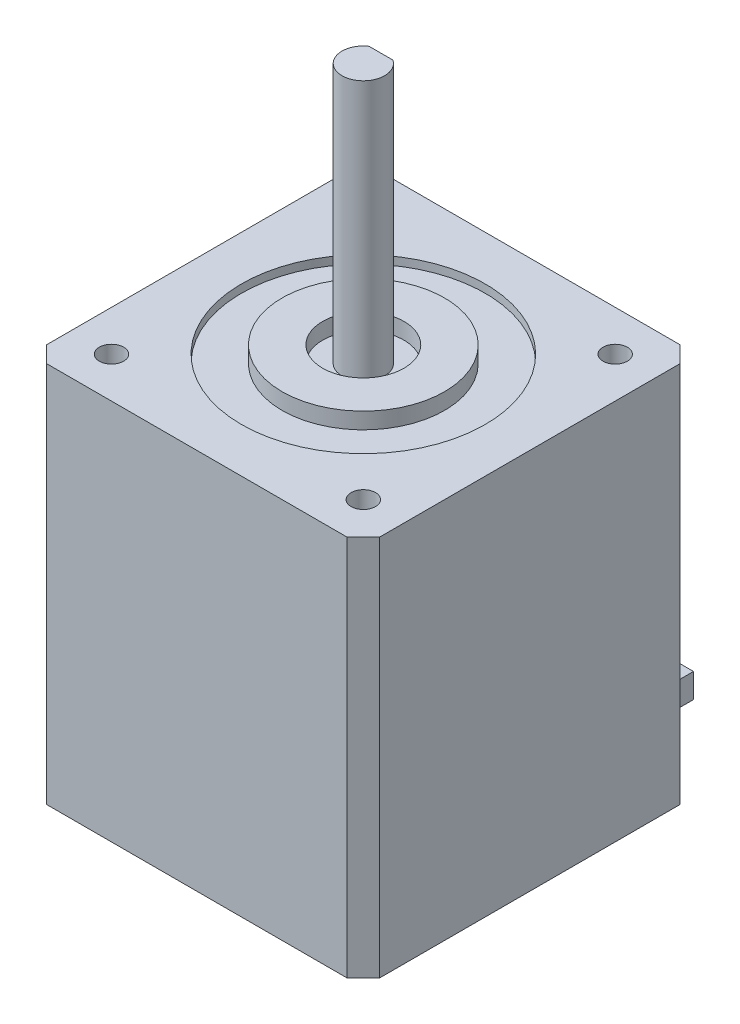
ISO-10303-21;
HEADER;
FILE_DESCRIPTION(('STEP AP214'),'2;1');
FILE_NAME('part.step','',(''),(''),'','','');
FILE_SCHEMA(('AUTOMOTIVE_DESIGN { 1 0 10303 214 1 1 1 1 }'));
ENDSEC;
DATA;
#1=APPLICATION_CONTEXT('core data for automotive mechanical design processes');
#2=APPLICATION_PROTOCOL_DEFINITION('international standard','automotive_design',2000,#1);
#3=PRODUCT_CONTEXT('',#1,'mechanical');
#4=PRODUCT('Part','Part','',(#3));
#5=PRODUCT_RELATED_PRODUCT_CATEGORY('part','',(#4));
#6=PRODUCT_DEFINITION_FORMATION('','',#4);
#7=PRODUCT_DEFINITION_CONTEXT('part definition',#1,'design');
#8=PRODUCT_DEFINITION('design','',#6,#7);
#9=PRODUCT_DEFINITION_SHAPE('','',#8);
#10=(LENGTH_UNIT() NAMED_UNIT(*) SI_UNIT(.MILLI.,.METRE.));
#11=(NAMED_UNIT(*) PLANE_ANGLE_UNIT() SI_UNIT($,.RADIAN.));
#12=(NAMED_UNIT(*) SI_UNIT($,.STERADIAN.) SOLID_ANGLE_UNIT());
#13=UNCERTAINTY_MEASURE_WITH_UNIT(LENGTH_MEASURE(1.E-05),#10,'distance_accuracy_value','');
#14=(GEOMETRIC_REPRESENTATION_CONTEXT(3) GLOBAL_UNCERTAINTY_ASSIGNED_CONTEXT((#13)) GLOBAL_UNIT_ASSIGNED_CONTEXT((#10,
#11,#12)) REPRESENTATION_CONTEXT('',''));
#15=CARTESIAN_POINT('',(0.,0.,0.));
#16=DIRECTION('',(0.,0.,1.));
#17=DIRECTION('',(1.,0.,0.));
#18=AXIS2_PLACEMENT_3D('',#15,#16,#17);
#19=CARTESIAN_POINT('',(-18.5,47.,-20.5));
#20=DIRECTION('',(0.,0.,1.));
#21=DIRECTION('',(1.,0.,0.));
#22=AXIS2_PLACEMENT_3D('',#19,#20,#21);
#23=PLANE('',#22);
#24=DIRECTION('',(0.,-1.,0.));
#25=VECTOR('',#24,1.);
#26=CARTESIAN_POINT('',(10.1415461571168,0.,-20.5));
#27=LINE('',#26,#25);
#28=CARTESIAN_POINT('',(10.1415461571168,3.,-20.5));
#29=VERTEX_POINT('',#28);
#30=CARTESIAN_POINT('',(10.1415461571168,0.,-20.5));
#31=VERTEX_POINT('',#30);
#32=EDGE_CURVE('E57',#29,#31,#27,.T.);
#33=ORIENTED_EDGE('',*,*,#32,.F.);
#34=DIRECTION('',(1.,0.,0.));
#35=VECTOR('',#34,1.);
#36=CARTESIAN_POINT('',(10.1415461571168,3.,-20.5));
#37=LINE('',#36,#35);
#38=CARTESIAN_POINT('',(-9.85845384288318,3.,-20.5));
#39=VERTEX_POINT('',#38);
#40=EDGE_CURVE('E174',#39,#29,#37,.T.);
#41=ORIENTED_EDGE('',*,*,#40,.F.);
#42=DIRECTION('',(0.,1.,0.));
#43=VECTOR('',#42,1.);
#44=CARTESIAN_POINT('',(-9.85845384288318,0.,-20.5));
#45=LINE('',#44,#43);
#46=CARTESIAN_POINT('',(-9.85845384288318,0.,-20.5));
#47=VERTEX_POINT('',#46);
#48=EDGE_CURVE('E63',#47,#39,#45,.T.);
#49=ORIENTED_EDGE('',*,*,#48,.F.);
#50=DIRECTION('',(-1.,0.,0.));
#51=VECTOR('',#50,1.);
#52=CARTESIAN_POINT('',(-18.5,0.,-20.5));
#53=LINE('',#52,#51);
#54=CARTESIAN_POINT('',(-18.5,0.,-20.5));
#55=VERTEX_POINT('',#54);
#56=EDGE_CURVE('E234',#47,#55,#53,.T.);
#57=ORIENTED_EDGE('',*,*,#56,.T.);
#58=DIRECTION('',(0.,-1.,0.));
#59=VECTOR('',#58,1.);
#60=CARTESIAN_POINT('',(-18.5,47.,-20.5));
#61=LINE('',#60,#59);
#62=CARTESIAN_POINT('',(-18.5,47.,-20.5));
#63=VERTEX_POINT('',#62);
#64=EDGE_CURVE('E50',#63,#55,#61,.T.);
#65=ORIENTED_EDGE('',*,*,#64,.F.);
#66=DIRECTION('',(-1.,0.,0.));
#67=VECTOR('',#66,1.);
#68=CARTESIAN_POINT('',(-18.5,47.,-20.5));
#69=LINE('',#68,#67);
#70=CARTESIAN_POINT('',(18.5,47.,-20.5));
#71=VERTEX_POINT('',#70);
#72=EDGE_CURVE('E237',#71,#63,#69,.T.);
#73=ORIENTED_EDGE('',*,*,#72,.F.);
#74=DIRECTION('',(0.,-1.,0.));
#75=VECTOR('',#74,1.);
#76=CARTESIAN_POINT('',(18.5,47.,-20.5));
#77=LINE('',#76,#75);
#78=CARTESIAN_POINT('',(18.5,0.,-20.5));
#79=VERTEX_POINT('',#78);
#80=EDGE_CURVE('E255',#71,#79,#77,.T.);
#81=ORIENTED_EDGE('',*,*,#80,.T.);
#82=EDGE_CURVE('E256',#79,#31,#53,.T.);
#83=ORIENTED_EDGE('',*,*,#82,.T.);
#84=EDGE_LOOP('',(#33,#41,#49,#57,#65,#73,#81,#83));
#85=FACE_BOUND('',#84,.T.);
#86=ADVANCED_FACE('F43',(#85),#23,.F.);
#87=CARTESIAN_POINT('',(0.,46.,0.));
#88=DIRECTION('',(0.,1.,0.));
#89=DIRECTION('',(0.,0.,1.));
#90=AXIS2_PLACEMENT_3D('',#87,#88,#89);
#91=PLANE('',#90);
#92=CARTESIAN_POINT('',(0.,46.,0.));
#93=DIRECTION('',(0.,1.,0.));
#94=DIRECTION('',(0.,0.,1.));
#95=AXIS2_PLACEMENT_3D('',#92,#93,#94);
#96=CIRCLE('',#95,5.);
#97=CARTESIAN_POINT('',(0.,46.,5.));
#98=VERTEX_POINT('',#97);
#99=EDGE_CURVE('E11',#98,#98,#96,.F.);
#100=ORIENTED_EDGE('',*,*,#99,.F.);
#101=EDGE_LOOP('',(#100));
#102=FACE_BOUND('',#101,.T.);
#103=DIRECTION('',(-1.,0.,0.));
#104=VECTOR('',#103,1.);
#105=CARTESIAN_POINT('',(-1.47098416147173,46.,-2.17535911633604));
#106=LINE('',#105,#104);
#107=CARTESIAN_POINT('',(1.47098416147173,46.,-2.17535911633604));
#108=VERTEX_POINT('',#107);
#109=CARTESIAN_POINT('',(-1.47098416147173,46.,-2.17535911633604));
#110=VERTEX_POINT('',#109);
#111=EDGE_CURVE('E211',#108,#110,#106,.T.);
#112=ORIENTED_EDGE('',*,*,#111,.F.);
#113=CARTESIAN_POINT('',(0.,46.,0.));
#114=DIRECTION('',(0.,1.,0.));
#115=DIRECTION('',(0.,0.,1.));
#116=AXIS2_PLACEMENT_3D('',#113,#114,#115);
#117=CIRCLE('',#116,2.62602012336673);
#118=EDGE_CURVE('E206',#110,#108,#117,.T.);
#119=ORIENTED_EDGE('',*,*,#118,.F.);
#120=EDGE_LOOP('',(#112,#119));
#121=FACE_BOUND('',#120,.T.);
#122=ADVANCED_FACE('F338',(#102,#121),#91,.T.);
#123=CARTESIAN_POINT('',(0.,46.,0.));
#124=DIRECTION('',(0.,1.,0.));
#125=DIRECTION('',(0.,0.,1.));
#126=AXIS2_PLACEMENT_3D('',#123,#124,#125);
#127=CIRCLE('',#126,15.);
#128=CARTESIAN_POINT('',(0.,46.,15.));
#129=VERTEX_POINT('',#128);
#130=EDGE_CURVE('E231',#129,#129,#127,.T.);
#131=ORIENTED_EDGE('',*,*,#130,.T.);
#132=EDGE_LOOP('',(#131));
#133=FACE_BOUND('',#132,.T.);
#134=CARTESIAN_POINT('',(0.,46.,0.));
#135=DIRECTION('',(0.,1.,0.));
#136=DIRECTION('',(0.,0.,1.));
#137=AXIS2_PLACEMENT_3D('',#134,#135,#136);
#138=CIRCLE('',#137,10.);
#139=CARTESIAN_POINT('',(0.,46.,10.));
#140=VERTEX_POINT('',#139);
#141=EDGE_CURVE('E224',#140,#140,#138,.T.);
#142=ORIENTED_EDGE('',*,*,#141,.F.);
#143=EDGE_LOOP('',(#142));
#144=FACE_BOUND('',#143,.T.);
#145=ADVANCED_FACE('F343',(#133,#144),#91,.T.);
#146=CARTESIAN_POINT('',(-20.5,47.,-18.5));
#147=DIRECTION('',(0.707106781186547,0.,0.707106781186548));
#148=DIRECTION('',(0.707106781186548,0.,-0.707106781186547));
#149=AXIS2_PLACEMENT_3D('',#146,#147,#148);
#150=PLANE('',#149);
#151=DIRECTION('',(-0.707106781186548,0.,0.707106781186547));
#152=VECTOR('',#151,1.);
#153=CARTESIAN_POINT('',(-20.5,0.,-18.5));
#154=LINE('',#153,#152);
#155=CARTESIAN_POINT('',(-20.5,0.,-18.5));
#156=VERTEX_POINT('',#155);
#157=EDGE_CURVE('E258',#55,#156,#154,.T.);
#158=ORIENTED_EDGE('',*,*,#157,.T.);
#159=DIRECTION('',(0.,-1.,0.));
#160=VECTOR('',#159,1.);
#161=CARTESIAN_POINT('',(-20.5,47.,-18.5));
#162=LINE('',#161,#160);
#163=CARTESIAN_POINT('',(-20.5,47.,-18.5));
#164=VERTEX_POINT('',#163);
#165=EDGE_CURVE('E288',#164,#156,#162,.T.);
#166=ORIENTED_EDGE('',*,*,#165,.F.);
#167=DIRECTION('',(-0.707106781186548,0.,0.707106781186547));
#168=VECTOR('',#167,1.);
#169=CARTESIAN_POINT('',(-20.5,47.,-18.5));
#170=LINE('',#169,#168);
#171=EDGE_CURVE('E240',#63,#164,#170,.T.);
#172=ORIENTED_EDGE('',*,*,#171,.F.);
#173=ORIENTED_EDGE('',*,*,#64,.T.);
#174=EDGE_LOOP('',(#158,#166,#172,#173));
#175=FACE_BOUND('',#174,.T.);
#176=ADVANCED_FACE('F293',(#175),#150,.F.);
#177=CARTESIAN_POINT('',(-20.5,47.,18.5));
#178=DIRECTION('',(1.,0.,0.));
#179=DIRECTION('',(0.,0.,-1.));
#180=AXIS2_PLACEMENT_3D('',#177,#178,#179);
#181=PLANE('',#180);
#182=DIRECTION('',(0.,0.,1.));
#183=VECTOR('',#182,1.);
#184=CARTESIAN_POINT('',(-20.5,0.,18.5));
#185=LINE('',#184,#183);
#186=CARTESIAN_POINT('',(-20.5,0.,18.5));
#187=VERTEX_POINT('',#186);
#188=EDGE_CURVE('E260',#156,#187,#185,.T.);
#189=ORIENTED_EDGE('',*,*,#188,.T.);
#190=DIRECTION('',(0.,-1.,0.));
#191=VECTOR('',#190,1.);
#192=CARTESIAN_POINT('',(-20.5,47.,18.5));
#193=LINE('',#192,#191);
#194=CARTESIAN_POINT('',(-20.5,47.,18.5));
#195=VERTEX_POINT('',#194);
#196=EDGE_CURVE('E285',#195,#187,#193,.T.);
#197=ORIENTED_EDGE('',*,*,#196,.F.);
#198=DIRECTION('',(0.,0.,1.));
#199=VECTOR('',#198,1.);
#200=CARTESIAN_POINT('',(-20.5,47.,18.5));
#201=LINE('',#200,#199);
#202=EDGE_CURVE('E243',#164,#195,#201,.T.);
#203=ORIENTED_EDGE('',*,*,#202,.F.);
#204=ORIENTED_EDGE('',*,*,#165,.T.);
#205=EDGE_LOOP('',(#189,#197,#203,#204));
#206=FACE_BOUND('',#205,.T.);
#207=ADVANCED_FACE('F302',(#206),#181,.F.);
#208=CARTESIAN_POINT('',(-18.5,47.,20.5));
#209=DIRECTION('',(0.707106781186547,0.,-0.707106781186548));
#210=DIRECTION('',(-0.707106781186548,0.,-0.707106781186547));
#211=AXIS2_PLACEMENT_3D('',#208,#209,#210);
#212=PLANE('',#211);
#213=DIRECTION('',(0.707106781186548,0.,0.707106781186547));
#214=VECTOR('',#213,1.);
#215=CARTESIAN_POINT('',(-18.5,0.,20.5));
#216=LINE('',#215,#214);
#217=CARTESIAN_POINT('',(-18.5,0.,20.5));
#218=VERTEX_POINT('',#217);
#219=EDGE_CURVE('E262',#187,#218,#216,.T.);
#220=ORIENTED_EDGE('',*,*,#219,.T.);
#221=DIRECTION('',(0.,-1.,0.));
#222=VECTOR('',#221,1.);
#223=CARTESIAN_POINT('',(-18.5,47.,20.5));
#224=LINE('',#223,#222);
#225=CARTESIAN_POINT('',(-18.5,47.,20.5));
#226=VERTEX_POINT('',#225);
#227=EDGE_CURVE('E282',#226,#218,#224,.T.);
#228=ORIENTED_EDGE('',*,*,#227,.F.);
#229=DIRECTION('',(0.707106781186548,0.,0.707106781186547));
#230=VECTOR('',#229,1.);
#231=CARTESIAN_POINT('',(-18.5,47.,20.5));
#232=LINE('',#231,#230);
#233=EDGE_CURVE('E245',#195,#226,#232,.T.);
#234=ORIENTED_EDGE('',*,*,#233,.F.);
#235=ORIENTED_EDGE('',*,*,#196,.T.);
#236=EDGE_LOOP('',(#220,#228,#234,#235));
#237=FACE_BOUND('',#236,.T.);
#238=ADVANCED_FACE('F306',(#237),#212,.F.);
#239=CARTESIAN_POINT('',(-18.5,47.,20.5));
#240=DIRECTION('',(0.,0.,-1.));
#241=DIRECTION('',(-1.,0.,0.));
#242=AXIS2_PLACEMENT_3D('',#239,#240,#241);
#243=PLANE('',#242);
#244=DIRECTION('',(1.,0.,0.));
#245=VECTOR('',#244,1.);
#246=CARTESIAN_POINT('',(-18.5,0.,20.5));
#247=LINE('',#246,#245);
#248=CARTESIAN_POINT('',(18.5,0.,20.5));
#249=VERTEX_POINT('',#248);
#250=EDGE_CURVE('E264',#218,#249,#247,.T.);
#251=ORIENTED_EDGE('',*,*,#250,.T.);
#252=DIRECTION('',(0.,-1.,0.));
#253=VECTOR('',#252,1.);
#254=CARTESIAN_POINT('',(18.5,47.,20.5));
#255=LINE('',#254,#253);
#256=CARTESIAN_POINT('',(18.5,47.,20.5));
#257=VERTEX_POINT('',#256);
#258=EDGE_CURVE('E279',#257,#249,#255,.T.);
#259=ORIENTED_EDGE('',*,*,#258,.F.);
#260=DIRECTION('',(1.,0.,0.));
#261=VECTOR('',#260,1.);
#262=CARTESIAN_POINT('',(-18.5,47.,20.5));
#263=LINE('',#262,#261);
#264=EDGE_CURVE('E247',#226,#257,#263,.T.);
#265=ORIENTED_EDGE('',*,*,#264,.F.);
#266=ORIENTED_EDGE('',*,*,#227,.T.);
#267=EDGE_LOOP('',(#251,#259,#265,#266));
#268=FACE_BOUND('',#267,.T.);
#269=ADVANCED_FACE('F328',(#268),#243,.F.);
#270=CARTESIAN_POINT('',(18.5,47.,20.5));
#271=DIRECTION('',(-0.707106781186547,0.,-0.707106781186548));
#272=DIRECTION('',(-0.707106781186548,0.,0.707106781186547));
#273=AXIS2_PLACEMENT_3D('',#270,#271,#272);
#274=PLANE('',#273);
#275=DIRECTION('',(0.707106781186548,0.,-0.707106781186547));
#276=VECTOR('',#275,1.);
#277=CARTESIAN_POINT('',(18.5,0.,20.5));
#278=LINE('',#277,#276);
#279=CARTESIAN_POINT('',(20.5,0.,18.5));
#280=VERTEX_POINT('',#279);
#281=EDGE_CURVE('E266',#249,#280,#278,.T.);
#282=ORIENTED_EDGE('',*,*,#281,.T.);
#283=DIRECTION('',(0.,-1.,0.));
#284=VECTOR('',#283,1.);
#285=CARTESIAN_POINT('',(20.5,47.,18.5));
#286=LINE('',#285,#284);
#287=CARTESIAN_POINT('',(20.5,47.,18.5));
#288=VERTEX_POINT('',#287);
#289=EDGE_CURVE('E276',#288,#280,#286,.T.);
#290=ORIENTED_EDGE('',*,*,#289,.F.);
#291=DIRECTION('',(0.707106781186548,0.,-0.707106781186547));
#292=VECTOR('',#291,1.);
#293=CARTESIAN_POINT('',(18.5,47.,20.5));
#294=LINE('',#293,#292);
#295=EDGE_CURVE('E249',#257,#288,#294,.T.);
#296=ORIENTED_EDGE('',*,*,#295,.F.);
#297=ORIENTED_EDGE('',*,*,#258,.T.);
#298=EDGE_LOOP('',(#282,#290,#296,#297));
#299=FACE_BOUND('',#298,.T.);
#300=ADVANCED_FACE('F326',(#299),#274,.F.);
#301=CARTESIAN_POINT('',(20.5,47.,18.5));
#302=DIRECTION('',(-1.,0.,0.));
#303=DIRECTION('',(0.,0.,1.));
#304=AXIS2_PLACEMENT_3D('',#301,#302,#303);
#305=PLANE('',#304);
#306=DIRECTION('',(0.,0.,-1.));
#307=VECTOR('',#306,1.);
#308=CARTESIAN_POINT('',(20.5,0.,18.5));
#309=LINE('',#308,#307);
#310=CARTESIAN_POINT('',(20.5,0.,-18.5));
#311=VERTEX_POINT('',#310);
#312=EDGE_CURVE('E268',#280,#311,#309,.T.);
#313=ORIENTED_EDGE('',*,*,#312,.T.);
#314=DIRECTION('',(0.,-1.,0.));
#315=VECTOR('',#314,1.);
#316=CARTESIAN_POINT('',(20.5,47.,-18.5));
#317=LINE('',#316,#315);
#318=CARTESIAN_POINT('',(20.5,47.,-18.5));
#319=VERTEX_POINT('',#318);
#320=EDGE_CURVE('E273',#319,#311,#317,.T.);
#321=ORIENTED_EDGE('',*,*,#320,.F.);
#322=DIRECTION('',(0.,0.,-1.));
#323=VECTOR('',#322,1.);
#324=CARTESIAN_POINT('',(20.5,47.,18.5));
#325=LINE('',#324,#323);
#326=EDGE_CURVE('E251',#288,#319,#325,.T.);
#327=ORIENTED_EDGE('',*,*,#326,.F.);
#328=ORIENTED_EDGE('',*,*,#289,.T.);
#329=EDGE_LOOP('',(#313,#321,#327,#328));
#330=FACE_BOUND('',#329,.T.);
#331=ADVANCED_FACE('F322',(#330),#305,.F.);
#332=CARTESIAN_POINT('',(20.5,47.,-18.5));
#333=DIRECTION('',(-0.707106781186547,0.,0.707106781186547));
#334=DIRECTION('',(0.707106781186548,0.,0.707106781186548));
#335=AXIS2_PLACEMENT_3D('',#332,#333,#334);
#336=PLANE('',#335);
#337=DIRECTION('',(-0.707106781186547,0.,-0.707106781186547));
#338=VECTOR('',#337,1.);
#339=CARTESIAN_POINT('',(20.5,0.,-18.5));
#340=LINE('',#339,#338);
#341=EDGE_CURVE('E241',#311,#79,#340,.T.);
#342=ORIENTED_EDGE('',*,*,#341,.T.);
#343=ORIENTED_EDGE('',*,*,#80,.F.);
#344=DIRECTION('',(-0.707106781186547,0.,-0.707106781186547));
#345=VECTOR('',#344,1.);
#346=CARTESIAN_POINT('',(20.5,47.,-18.5));
#347=LINE('',#346,#345);
#348=EDGE_CURVE('E253',#319,#71,#347,.T.);
#349=ORIENTED_EDGE('',*,*,#348,.F.);
#350=ORIENTED_EDGE('',*,*,#320,.T.);
#351=EDGE_LOOP('',(#342,#343,#349,#350));
#352=FACE_BOUND('',#351,.T.);
#353=ADVANCED_FACE('F317',(#352),#336,.F.);
#354=CARTESIAN_POINT('',(20.5,47.,-20.5));
#355=DIRECTION('',(0.,1.,0.));
#356=DIRECTION('',(0.,0.,1.));
#357=AXIS2_PLACEMENT_3D('',#354,#355,#356);
#358=PLANE('',#357);
#359=CARTESIAN_POINT('',(15.5,47.,-15.5));
#360=DIRECTION('',(0.,1.,0.));
#361=DIRECTION('',(0.,0.,1.));
#362=AXIS2_PLACEMENT_3D('',#359,#360,#361);
#363=CIRCLE('',#362,1.5);
#364=CARTESIAN_POINT('',(15.5,47.,-14.));
#365=VERTEX_POINT('',#364);
#366=EDGE_CURVE('E177',#365,#365,#363,.T.);
#367=ORIENTED_EDGE('',*,*,#366,.F.);
#368=EDGE_LOOP('',(#367));
#369=FACE_BOUND('',#368,.T.);
#370=CARTESIAN_POINT('',(-15.5,47.,-15.5));
#371=DIRECTION('',(0.,1.,0.));
#372=DIRECTION('',(0.,0.,1.));
#373=AXIS2_PLACEMENT_3D('',#370,#371,#372);
#374=CIRCLE('',#373,1.5);
#375=CARTESIAN_POINT('',(-15.5,47.,-14.));
#376=VERTEX_POINT('',#375);
#377=EDGE_CURVE('E188',#376,#376,#374,.T.);
#378=ORIENTED_EDGE('',*,*,#377,.F.);
#379=EDGE_LOOP('',(#378));
#380=FACE_BOUND('',#379,.T.);
#381=CARTESIAN_POINT('',(-15.5,47.,15.5));
#382=DIRECTION('',(0.,1.,0.));
#383=DIRECTION('',(0.,0.,1.));
#384=AXIS2_PLACEMENT_3D('',#381,#382,#383);
#385=CIRCLE('',#384,1.5);
#386=CARTESIAN_POINT('',(-15.5,47.,17.));
#387=VERTEX_POINT('',#386);
#388=EDGE_CURVE('E194',#387,#387,#385,.T.);
#389=ORIENTED_EDGE('',*,*,#388,.F.);
#390=EDGE_LOOP('',(#389));
#391=FACE_BOUND('',#390,.T.);
#392=CARTESIAN_POINT('',(15.5,47.,15.5));
#393=DIRECTION('',(0.,1.,0.));
#394=DIRECTION('',(0.,0.,1.));
#395=AXIS2_PLACEMENT_3D('',#392,#393,#394);
#396=CIRCLE('',#395,1.5);
#397=CARTESIAN_POINT('',(15.5,47.,17.));
#398=VERTEX_POINT('',#397);
#399=EDGE_CURVE('E200',#398,#398,#396,.T.);
#400=ORIENTED_EDGE('',*,*,#399,.F.);
#401=EDGE_LOOP('',(#400));
#402=FACE_BOUND('',#401,.T.);
#403=CARTESIAN_POINT('',(0.,47.,0.));
#404=DIRECTION('',(0.,1.,0.));
#405=DIRECTION('',(0.,0.,1.));
#406=AXIS2_PLACEMENT_3D('',#403,#404,#405);
#407=CIRCLE('',#406,15.);
#408=CARTESIAN_POINT('',(0.,47.,15.));
#409=VERTEX_POINT('',#408);
#410=EDGE_CURVE('E228',#409,#409,#407,.T.);
#411=ORIENTED_EDGE('',*,*,#410,.F.);
#412=EDGE_LOOP('',(#411));
#413=FACE_BOUND('',#412,.T.);
#414=ORIENTED_EDGE('',*,*,#72,.T.);
#415=ORIENTED_EDGE('',*,*,#171,.T.);
#416=ORIENTED_EDGE('',*,*,#202,.T.);
#417=ORIENTED_EDGE('',*,*,#233,.T.);
#418=ORIENTED_EDGE('',*,*,#264,.T.);
#419=ORIENTED_EDGE('',*,*,#295,.T.);
#420=ORIENTED_EDGE('',*,*,#326,.T.);
#421=ORIENTED_EDGE('',*,*,#348,.T.);
#422=EDGE_LOOP('',(#414,#415,#416,#417,#418,#419,#420,#421));
#423=FACE_BOUND('',#422,.T.);
#424=ADVANCED_FACE('F310',(#369,#380,#391,#402,#413,#423),#358,.T.);
#425=CARTESIAN_POINT('',(20.5,0.,-20.5));
#426=DIRECTION('',(0.,1.,0.));
#427=DIRECTION('',(0.,0.,1.));
#428=AXIS2_PLACEMENT_3D('',#425,#426,#427);
#429=PLANE('',#428);
#430=ORIENTED_EDGE('',*,*,#82,.F.);
#431=ORIENTED_EDGE('',*,*,#341,.F.);
#432=ORIENTED_EDGE('',*,*,#312,.F.);
#433=ORIENTED_EDGE('',*,*,#281,.F.);
#434=ORIENTED_EDGE('',*,*,#250,.F.);
#435=ORIENTED_EDGE('',*,*,#219,.F.);
#436=ORIENTED_EDGE('',*,*,#188,.F.);
#437=ORIENTED_EDGE('',*,*,#157,.F.);
#438=ORIENTED_EDGE('',*,*,#56,.F.);
#439=DIRECTION('',(0.,0.,1.));
#440=VECTOR('',#439,1.);
#441=CARTESIAN_POINT('',(-9.85845384288318,0.,-30.5));
#442=LINE('',#441,#440);
#443=CARTESIAN_POINT('',(-9.85845384288318,0.,-30.5));
#444=VERTEX_POINT('',#443);
#445=EDGE_CURVE('E161',#444,#47,#442,.T.);
#446=ORIENTED_EDGE('',*,*,#445,.F.);
#447=DIRECTION('',(-1.,0.,0.));
#448=VECTOR('',#447,1.);
#449=CARTESIAN_POINT('',(10.1415461571168,0.,-30.5));
#450=LINE('',#449,#448);
#451=CARTESIAN_POINT('',(10.1415461571168,0.,-30.5));
#452=VERTEX_POINT('',#451);
#453=EDGE_CURVE('E154',#452,#444,#450,.T.);
#454=ORIENTED_EDGE('',*,*,#453,.F.);
#455=DIRECTION('',(0.,0.,1.));
#456=VECTOR('',#455,1.);
#457=CARTESIAN_POINT('',(10.1415461571168,0.,-30.5));
#458=LINE('',#457,#456);
#459=EDGE_CURVE('E159',#452,#31,#458,.T.);
#460=ORIENTED_EDGE('',*,*,#459,.T.);
#461=EDGE_LOOP('',(#430,#431,#432,#433,#434,#435,#436,#437,#438,#446,#454,#460));
#462=FACE_BOUND('',#461,.T.);
#463=ADVANCED_FACE('F157',(#462),#429,.F.);
#464=CARTESIAN_POINT('',(0.,46.,0.));
#465=DIRECTION('',(0.,1.,0.));
#466=DIRECTION('',(0.,0.,1.));
#467=AXIS2_PLACEMENT_3D('',#464,#465,#466);
#468=CYLINDRICAL_SURFACE('',#467,15.);
#469=ORIENTED_EDGE('',*,*,#130,.F.);
#470=EDGE_LOOP('',(#469));
#471=FACE_BOUND('',#470,.T.);
#472=ORIENTED_EDGE('',*,*,#410,.T.);
#473=EDGE_LOOP('',(#472));
#474=FACE_BOUND('',#473,.T.);
#475=ADVANCED_FACE('F358',(#471,#474),#468,.F.);
#476=CARTESIAN_POINT('',(0.,48.,0.));
#477=DIRECTION('',(0.,1.,0.));
#478=DIRECTION('',(0.,0.,1.));
#479=AXIS2_PLACEMENT_3D('',#476,#477,#478);
#480=PLANE('',#479);
#481=CARTESIAN_POINT('',(0.,48.,0.));
#482=DIRECTION('',(0.,1.,0.));
#483=DIRECTION('',(0.,0.,1.));
#484=AXIS2_PLACEMENT_3D('',#481,#482,#483);
#485=CIRCLE('',#484,10.);
#486=CARTESIAN_POINT('',(0.,48.,10.));
#487=VERTEX_POINT('',#486);
#488=EDGE_CURVE('E225',#487,#487,#485,.T.);
#489=ORIENTED_EDGE('',*,*,#488,.T.);
#490=EDGE_LOOP('',(#489));
#491=FACE_BOUND('',#490,.T.);
#492=CARTESIAN_POINT('',(0.,48.,0.));
#493=DIRECTION('',(0.,1.,0.));
#494=DIRECTION('',(0.,0.,1.));
#495=AXIS2_PLACEMENT_3D('',#492,#493,#494);
#496=CIRCLE('',#495,5.);
#497=CARTESIAN_POINT('',(0.,48.,5.));
#498=VERTEX_POINT('',#497);
#499=EDGE_CURVE('E221',#498,#498,#496,.T.);
#500=ORIENTED_EDGE('',*,*,#499,.F.);
#501=EDGE_LOOP('',(#500));
#502=FACE_BOUND('',#501,.T.);
#503=ADVANCED_FACE('F361',(#491,#502),#480,.T.);
#504=CARTESIAN_POINT('',(0.,48.,0.));
#505=DIRECTION('',(0.,-1.,0.));
#506=DIRECTION('',(0.,0.,-1.));
#507=AXIS2_PLACEMENT_3D('',#504,#505,#506);
#508=CYLINDRICAL_SURFACE('',#507,10.);
#509=ORIENTED_EDGE('',*,*,#488,.F.);
#510=EDGE_LOOP('',(#509));
#511=FACE_BOUND('',#510,.T.);
#512=ORIENTED_EDGE('',*,*,#141,.T.);
#513=EDGE_LOOP('',(#512));
#514=FACE_BOUND('',#513,.T.);
#515=ADVANCED_FACE('F356',(#511,#514),#508,.T.);
#516=CARTESIAN_POINT('',(0.,48.,0.));
#517=DIRECTION('',(0.,-1.,0.));
#518=DIRECTION('',(0.,0.,-1.));
#519=AXIS2_PLACEMENT_3D('',#516,#517,#518);
#520=CYLINDRICAL_SURFACE('',#519,5.);
#521=ORIENTED_EDGE('',*,*,#499,.T.);
#522=EDGE_LOOP('',(#521));
#523=FACE_BOUND('',#522,.T.);
#524=ORIENTED_EDGE('',*,*,#99,.T.);
#525=EDGE_LOOP('',(#524));
#526=FACE_BOUND('',#525,.T.);
#527=ADVANCED_FACE('F531',(#523,#526),#520,.F.);
#528=CARTESIAN_POINT('',(0.,78.,0.));
#529=DIRECTION('',(0.,-1.,0.));
#530=DIRECTION('',(0.,0.,-1.));
#531=AXIS2_PLACEMENT_3D('',#528,#529,#530);
#532=CYLINDRICAL_SURFACE('',#531,2.62602012336673);
#533=ORIENTED_EDGE('',*,*,#118,.T.);
#534=DIRECTION('',(0.,-1.,0.));
#535=VECTOR('',#534,1.);
#536=CARTESIAN_POINT('',(1.47098416147173,78.,-2.17535911633604));
#537=LINE('',#536,#535);
#538=CARTESIAN_POINT('',(1.47098416147173,78.,-2.17535911633604));
#539=VERTEX_POINT('',#538);
#540=EDGE_CURVE('E218',#539,#108,#537,.T.);
#541=ORIENTED_EDGE('',*,*,#540,.F.);
#542=CARTESIAN_POINT('',(0.,78.,0.));
#543=DIRECTION('',(0.,1.,0.));
#544=DIRECTION('',(0.,0.,1.));
#545=AXIS2_PLACEMENT_3D('',#542,#543,#544);
#546=CIRCLE('',#545,2.62602012336673);
#547=CARTESIAN_POINT('',(-1.47098416147173,78.,-2.17535911633604));
#548=VERTEX_POINT('',#547);
#549=EDGE_CURVE('E207',#548,#539,#546,.T.);
#550=ORIENTED_EDGE('',*,*,#549,.F.);
#551=DIRECTION('',(0.,-1.,0.));
#552=VECTOR('',#551,1.);
#553=CARTESIAN_POINT('',(-1.47098416147173,78.,-2.17535911633604));
#554=LINE('',#553,#552);
#555=EDGE_CURVE('E213',#548,#110,#554,.T.);
#556=ORIENTED_EDGE('',*,*,#555,.T.);
#557=EDGE_LOOP('',(#533,#541,#550,#556));
#558=FACE_BOUND('',#557,.T.);
#559=ADVANCED_FACE('F524',(#558),#532,.T.);
#560=CARTESIAN_POINT('',(-1.47098416147173,78.,-2.17535911633604));
#561=DIRECTION('',(0.,0.,1.));
#562=DIRECTION('',(1.,0.,0.));
#563=AXIS2_PLACEMENT_3D('',#560,#561,#562);
#564=PLANE('',#563);
#565=ORIENTED_EDGE('',*,*,#111,.T.);
#566=ORIENTED_EDGE('',*,*,#555,.F.);
#567=DIRECTION('',(-1.,0.,0.));
#568=VECTOR('',#567,1.);
#569=CARTESIAN_POINT('',(-1.47098416147173,78.,-2.17535911633604));
#570=LINE('',#569,#568);
#571=EDGE_CURVE('E210',#539,#548,#570,.T.);
#572=ORIENTED_EDGE('',*,*,#571,.F.);
#573=ORIENTED_EDGE('',*,*,#540,.T.);
#574=EDGE_LOOP('',(#565,#566,#572,#573));
#575=FACE_BOUND('',#574,.T.);
#576=ADVANCED_FACE('F515',(#575),#564,.F.);
#577=CARTESIAN_POINT('',(0.,78.,0.));
#578=DIRECTION('',(0.,1.,0.));
#579=DIRECTION('',(0.,0.,1.));
#580=AXIS2_PLACEMENT_3D('',#577,#578,#579);
#581=PLANE('',#580);
#582=ORIENTED_EDGE('',*,*,#549,.T.);
#583=ORIENTED_EDGE('',*,*,#571,.T.);
#584=EDGE_LOOP('',(#582,#583));
#585=FACE_BOUND('',#584,.T.);
#586=ADVANCED_FACE('F506',(#585),#581,.T.);
#587=CARTESIAN_POINT('',(15.5,42.,15.5));
#588=DIRECTION('',(0.,1.,0.));
#589=DIRECTION('',(0.,0.,1.));
#590=AXIS2_PLACEMENT_3D('',#587,#588,#589);
#591=CONICAL_SURFACE('',#590,1.5,1.02974425867665);
#592=CARTESIAN_POINT('',(15.5,41.0987090714587,15.5));
#593=VERTEX_POINT('',#592);
#594=VERTEX_LOOP('',#593);
#595=FACE_BOUND('',#594,.T.);
#596=CARTESIAN_POINT('',(15.5,42.,15.5));
#597=DIRECTION('',(0.,1.,0.));
#598=DIRECTION('',(0.,0.,1.));
#599=AXIS2_PLACEMENT_3D('',#596,#597,#598);
#600=CIRCLE('',#599,1.5);
#601=CARTESIAN_POINT('',(15.5,42.,17.));
#602=VERTEX_POINT('',#601);
#603=EDGE_CURVE('E203',#602,#602,#600,.T.);
#604=ORIENTED_EDGE('',*,*,#603,.T.);
#605=EDGE_LOOP('',(#604));
#606=FACE_BOUND('',#605,.T.);
#607=ADVANCED_FACE('F497',(#595,#606),#591,.F.);
#608=CARTESIAN_POINT('',(15.5,47.,15.5));
#609=DIRECTION('',(0.,1.,0.));
#610=DIRECTION('',(0.,0.,1.));
#611=AXIS2_PLACEMENT_3D('',#608,#609,#610);
#612=CYLINDRICAL_SURFACE('',#611,1.5);
#613=ORIENTED_EDGE('',*,*,#603,.F.);
#614=EDGE_LOOP('',(#613));
#615=FACE_BOUND('',#614,.T.);
#616=ORIENTED_EDGE('',*,*,#399,.T.);
#617=EDGE_LOOP('',(#616));
#618=FACE_BOUND('',#617,.T.);
#619=ADVANCED_FACE('F488',(#615,#618),#612,.F.);
#620=CARTESIAN_POINT('',(-15.5,42.,15.5));
#621=DIRECTION('',(0.,1.,0.));
#622=DIRECTION('',(0.,0.,1.));
#623=AXIS2_PLACEMENT_3D('',#620,#621,#622);
#624=CONICAL_SURFACE('',#623,1.5,1.02974425867665);
#625=CARTESIAN_POINT('',(-15.5,41.0987090714587,15.5));
#626=VERTEX_POINT('',#625);
#627=VERTEX_LOOP('',#626);
#628=FACE_BOUND('',#627,.T.);
#629=CARTESIAN_POINT('',(-15.5,42.,15.5));
#630=DIRECTION('',(0.,1.,0.));
#631=DIRECTION('',(0.,0.,1.));
#632=AXIS2_PLACEMENT_3D('',#629,#630,#631);
#633=CIRCLE('',#632,1.5);
#634=CARTESIAN_POINT('',(-15.5,42.,17.));
#635=VERTEX_POINT('',#634);
#636=EDGE_CURVE('E197',#635,#635,#633,.T.);
#637=ORIENTED_EDGE('',*,*,#636,.T.);
#638=EDGE_LOOP('',(#637));
#639=FACE_BOUND('',#638,.T.);
#640=ADVANCED_FACE('F479',(#628,#639),#624,.F.);
#641=CARTESIAN_POINT('',(-15.5,47.,15.5));
#642=DIRECTION('',(0.,1.,0.));
#643=DIRECTION('',(0.,0.,1.));
#644=AXIS2_PLACEMENT_3D('',#641,#642,#643);
#645=CYLINDRICAL_SURFACE('',#644,1.5);
#646=ORIENTED_EDGE('',*,*,#636,.F.);
#647=EDGE_LOOP('',(#646));
#648=FACE_BOUND('',#647,.T.);
#649=ORIENTED_EDGE('',*,*,#388,.T.);
#650=EDGE_LOOP('',(#649));
#651=FACE_BOUND('',#650,.T.);
#652=ADVANCED_FACE('F470',(#648,#651),#645,.F.);
#653=CARTESIAN_POINT('',(-15.5,42.,-15.5));
#654=DIRECTION('',(0.,1.,0.));
#655=DIRECTION('',(0.,0.,1.));
#656=AXIS2_PLACEMENT_3D('',#653,#654,#655);
#657=CONICAL_SURFACE('',#656,1.5,1.02974425867665);
#658=CARTESIAN_POINT('',(-15.5,41.0987090714587,-15.5));
#659=VERTEX_POINT('',#658);
#660=VERTEX_LOOP('',#659);
#661=FACE_BOUND('',#660,.T.);
#662=CARTESIAN_POINT('',(-15.5,42.,-15.5));
#663=DIRECTION('',(0.,1.,0.));
#664=DIRECTION('',(0.,0.,1.));
#665=AXIS2_PLACEMENT_3D('',#662,#663,#664);
#666=CIRCLE('',#665,1.5);
#667=CARTESIAN_POINT('',(-15.5,42.,-14.));
#668=VERTEX_POINT('',#667);
#669=EDGE_CURVE('E191',#668,#668,#666,.T.);
#670=ORIENTED_EDGE('',*,*,#669,.T.);
#671=EDGE_LOOP('',(#670));
#672=FACE_BOUND('',#671,.T.);
#673=ADVANCED_FACE('F461',(#661,#672),#657,.F.);
#674=CARTESIAN_POINT('',(-15.5,47.,-15.5));
#675=DIRECTION('',(0.,1.,0.));
#676=DIRECTION('',(0.,0.,1.));
#677=AXIS2_PLACEMENT_3D('',#674,#675,#676);
#678=CYLINDRICAL_SURFACE('',#677,1.5);
#679=ORIENTED_EDGE('',*,*,#669,.F.);
#680=EDGE_LOOP('',(#679));
#681=FACE_BOUND('',#680,.T.);
#682=ORIENTED_EDGE('',*,*,#377,.T.);
#683=EDGE_LOOP('',(#682));
#684=FACE_BOUND('',#683,.T.);
#685=ADVANCED_FACE('F452',(#681,#684),#678,.F.);
#686=CARTESIAN_POINT('',(15.5,42.,-15.5));
#687=DIRECTION('',(0.,1.,0.));
#688=DIRECTION('',(0.,0.,1.));
#689=AXIS2_PLACEMENT_3D('',#686,#687,#688);
#690=CONICAL_SURFACE('',#689,1.5,1.02974425867665);
#691=CARTESIAN_POINT('',(15.5,41.0987090714587,-15.5));
#692=VERTEX_POINT('',#691);
#693=VERTEX_LOOP('',#692);
#694=FACE_BOUND('',#693,.T.);
#695=CARTESIAN_POINT('',(15.5,42.,-15.5));
#696=DIRECTION('',(0.,1.,0.));
#697=DIRECTION('',(0.,0.,1.));
#698=AXIS2_PLACEMENT_3D('',#695,#696,#697);
#699=CIRCLE('',#698,1.5);
#700=CARTESIAN_POINT('',(15.5,42.,-14.));
#701=VERTEX_POINT('',#700);
#702=EDGE_CURVE('E180',#701,#701,#699,.T.);
#703=ORIENTED_EDGE('',*,*,#702,.T.);
#704=EDGE_LOOP('',(#703));
#705=FACE_BOUND('',#704,.T.);
#706=ADVANCED_FACE('F443',(#694,#705),#690,.F.);
#707=CARTESIAN_POINT('',(15.5,47.,-15.5));
#708=DIRECTION('',(0.,1.,0.));
#709=DIRECTION('',(0.,0.,1.));
#710=AXIS2_PLACEMENT_3D('',#707,#708,#709);
#711=CYLINDRICAL_SURFACE('',#710,1.5);
#712=ORIENTED_EDGE('',*,*,#702,.F.);
#713=EDGE_LOOP('',(#712));
#714=FACE_BOUND('',#713,.T.);
#715=ORIENTED_EDGE('',*,*,#366,.T.);
#716=EDGE_LOOP('',(#715));
#717=FACE_BOUND('',#716,.T.);
#718=ADVANCED_FACE('F404',(#714,#717),#711,.F.);
#719=CARTESIAN_POINT('',(10.1415461571168,0.,-30.5));
#720=DIRECTION('',(-1.,0.,0.));
#721=DIRECTION('',(0.,0.,1.));
#722=AXIS2_PLACEMENT_3D('',#719,#720,#721);
#723=PLANE('',#722);
#724=ORIENTED_EDGE('',*,*,#32,.T.);
#725=ORIENTED_EDGE('',*,*,#459,.F.);
#726=DIRECTION('',(0.,-1.,0.));
#727=VECTOR('',#726,1.);
#728=CARTESIAN_POINT('',(10.1415461571168,0.,-30.5));
#729=LINE('',#728,#727);
#730=CARTESIAN_POINT('',(10.1415461571168,3.,-30.5));
#731=VERTEX_POINT('',#730);
#732=EDGE_CURVE('E165',#731,#452,#729,.T.);
#733=ORIENTED_EDGE('',*,*,#732,.F.);
#734=DIRECTION('',(0.,0.,1.));
#735=VECTOR('',#734,1.);
#736=CARTESIAN_POINT('',(10.1415461571168,3.,-30.5));
#737=LINE('',#736,#735);
#738=EDGE_CURVE('E693',#731,#29,#737,.T.);
#739=ORIENTED_EDGE('',*,*,#738,.T.);
#740=EDGE_LOOP('',(#724,#725,#733,#739));
#741=FACE_BOUND('',#740,.T.);
#742=ADVANCED_FACE('F176',(#741),#723,.F.);
#743=CARTESIAN_POINT('',(-9.85845384288318,0.,-30.5));
#744=DIRECTION('',(1.,0.,0.));
#745=DIRECTION('',(0.,0.,-1.));
#746=AXIS2_PLACEMENT_3D('',#743,#744,#745);
#747=PLANE('',#746);
#748=ORIENTED_EDGE('',*,*,#48,.T.);
#749=DIRECTION('',(0.,0.,1.));
#750=VECTOR('',#749,1.);
#751=CARTESIAN_POINT('',(-9.85845384288318,3.,-30.5));
#752=LINE('',#751,#750);
#753=CARTESIAN_POINT('',(-9.85845384288318,3.,-30.5));
#754=VERTEX_POINT('',#753);
#755=EDGE_CURVE('E182',#754,#39,#752,.T.);
#756=ORIENTED_EDGE('',*,*,#755,.F.);
#757=DIRECTION('',(0.,1.,0.));
#758=VECTOR('',#757,1.);
#759=CARTESIAN_POINT('',(-9.85845384288318,0.,-30.5));
#760=LINE('',#759,#758);
#761=EDGE_CURVE('E164',#444,#754,#760,.T.);
#762=ORIENTED_EDGE('',*,*,#761,.F.);
#763=ORIENTED_EDGE('',*,*,#445,.T.);
#764=EDGE_LOOP('',(#748,#756,#762,#763));
#765=FACE_BOUND('',#764,.T.);
#766=ADVANCED_FACE('F403',(#765),#747,.F.);
#767=CARTESIAN_POINT('',(10.1415461571168,3.,-30.5));
#768=DIRECTION('',(0.,-1.,0.));
#769=DIRECTION('',(0.,0.,-1.));
#770=AXIS2_PLACEMENT_3D('',#767,#768,#769);
#771=PLANE('',#770);
#772=ORIENTED_EDGE('',*,*,#40,.T.);
#773=ORIENTED_EDGE('',*,*,#738,.F.);
#774=DIRECTION('',(1.,0.,0.));
#775=VECTOR('',#774,1.);
#776=CARTESIAN_POINT('',(10.1415461571168,3.,-30.5));
#777=LINE('',#776,#775);
#778=EDGE_CURVE('E170',#754,#731,#777,.T.);
#779=ORIENTED_EDGE('',*,*,#778,.F.);
#780=ORIENTED_EDGE('',*,*,#755,.T.);
#781=EDGE_LOOP('',(#772,#773,#779,#780));
#782=FACE_BOUND('',#781,.T.);
#783=ADVANCED_FACE('F412',(#782),#771,.F.);
#784=CARTESIAN_POINT('',(0.,0.,-30.5));
#785=DIRECTION('',(0.,0.,1.));
#786=DIRECTION('',(1.,0.,0.));
#787=AXIS2_PLACEMENT_3D('',#784,#785,#786);
#788=PLANE('',#787);
#789=ORIENTED_EDGE('',*,*,#732,.T.);
#790=ORIENTED_EDGE('',*,*,#453,.T.);
#791=ORIENTED_EDGE('',*,*,#761,.T.);
#792=ORIENTED_EDGE('',*,*,#778,.T.);
#793=EDGE_LOOP('',(#789,#790,#791,#792));
#794=FACE_BOUND('',#793,.T.);
#795=ADVANCED_FACE('F168',(#794),#788,.F.);
#796=CLOSED_SHELL('',(#86,#122,#145,#176,#207,#238,#269,#300,#331,#353,#424,#463,#475,#503,#515,
#527,#559,#576,#586,#607,#619,#640,#652,#673,#685,#706,#718,#742,#766,#783,#795));
#797=MANIFOLD_SOLID_BREP('B2',#796);
#798=ADVANCED_BREP_SHAPE_REPRESENTATION('',(#18,#797),#14);
#799=SHAPE_DEFINITION_REPRESENTATION(#9,#798);
ENDSEC;
END-ISO-10303-21;
